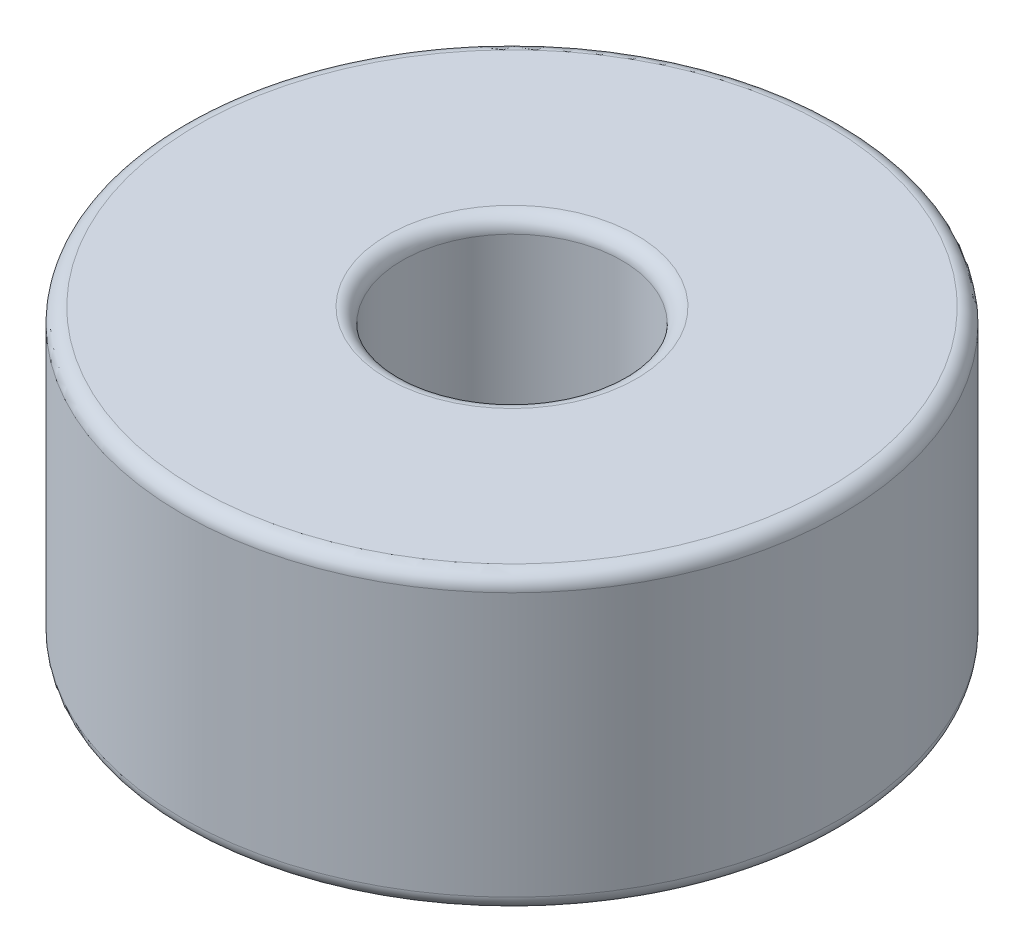
ISO-10303-21;
HEADER;
FILE_DESCRIPTION(('STEP AP214'),'2;1');
FILE_NAME('part.step','',(''),(''),'','','');
FILE_SCHEMA(('AUTOMOTIVE_DESIGN { 1 0 10303 214 1 1 1 1 }'));
ENDSEC;
DATA;
#1=APPLICATION_CONTEXT('core data for automotive mechanical design processes');
#2=APPLICATION_PROTOCOL_DEFINITION('international standard','automotive_design',2000,#1);
#3=PRODUCT_CONTEXT('',#1,'mechanical');
#4=PRODUCT('Part','Part','',(#3));
#5=PRODUCT_RELATED_PRODUCT_CATEGORY('part','',(#4));
#6=PRODUCT_DEFINITION_FORMATION('','',#4);
#7=PRODUCT_DEFINITION_CONTEXT('part definition',#1,'design');
#8=PRODUCT_DEFINITION('design','',#6,#7);
#9=PRODUCT_DEFINITION_SHAPE('','',#8);
#10=(LENGTH_UNIT() NAMED_UNIT(*) SI_UNIT(.MILLI.,.METRE.));
#11=(NAMED_UNIT(*) PLANE_ANGLE_UNIT() SI_UNIT($,.RADIAN.));
#12=(NAMED_UNIT(*) SI_UNIT($,.STERADIAN.) SOLID_ANGLE_UNIT());
#13=UNCERTAINTY_MEASURE_WITH_UNIT(LENGTH_MEASURE(1.E-05),#10,'distance_accuracy_value','');
#14=(GEOMETRIC_REPRESENTATION_CONTEXT(3) GLOBAL_UNCERTAINTY_ASSIGNED_CONTEXT((#13)) GLOBAL_UNIT_ASSIGNED_CONTEXT((#10,
#11,#12)) REPRESENTATION_CONTEXT('',''));
#15=CARTESIAN_POINT('',(0.,0.,0.));
#16=DIRECTION('',(0.,0.,1.));
#17=DIRECTION('',(1.,0.,0.));
#18=AXIS2_PLACEMENT_3D('',#15,#16,#17);
#19=CARTESIAN_POINT('',(0.,40.,0.));
#20=DIRECTION('',(0.,1.,0.));
#21=DIRECTION('',(0.,0.,1.));
#22=AXIS2_PLACEMENT_3D('',#19,#20,#21);
#23=PLANE('',#22);
#24=CARTESIAN_POINT('',(0.,40.,0.));
#25=DIRECTION('',(0.,1.,0.));
#26=DIRECTION('',(0.,0.,1.));
#27=AXIS2_PLACEMENT_3D('',#24,#25,#26);
#28=CIRCLE('',#27,17.);
#29=CARTESIAN_POINT('',(0.,40.,17.));
#30=VERTEX_POINT('',#29);
#31=EDGE_CURVE('E10',#30,#30,#28,.F.);
#32=ORIENTED_EDGE('',*,*,#31,.T.);
#33=EDGE_LOOP('',(#32));
#34=FACE_BOUND('',#33,.T.);
#35=CARTESIAN_POINT('',(0.,40.,0.));
#36=DIRECTION('',(0.,1.,0.));
#37=DIRECTION('',(0.,0.,1.));
#38=AXIS2_PLACEMENT_3D('',#35,#36,#37);
#39=CIRCLE('',#38,43.);
#40=CARTESIAN_POINT('',(0.,40.,43.));
#41=VERTEX_POINT('',#40);
#42=EDGE_CURVE('E38',#41,#41,#39,.T.);
#43=ORIENTED_EDGE('',*,*,#42,.T.);
#44=EDGE_LOOP('',(#43));
#45=FACE_BOUND('',#44,.T.);
#46=ADVANCED_FACE('F31',(#34,#45),#23,.T.);
#47=CARTESIAN_POINT('',(0.,0.,0.));
#48=DIRECTION('',(0.,1.,0.));
#49=DIRECTION('',(0.,0.,1.));
#50=AXIS2_PLACEMENT_3D('',#47,#48,#49);
#51=PLANE('',#50);
#52=CARTESIAN_POINT('',(0.,0.,0.));
#53=DIRECTION('',(0.,1.,0.));
#54=DIRECTION('',(0.,0.,1.));
#55=AXIS2_PLACEMENT_3D('',#52,#53,#54);
#56=CIRCLE('',#55,17.);
#57=CARTESIAN_POINT('',(0.,0.,17.));
#58=VERTEX_POINT('',#57);
#59=EDGE_CURVE('E57',#58,#58,#56,.T.);
#60=ORIENTED_EDGE('',*,*,#59,.T.);
#61=EDGE_LOOP('',(#60));
#62=FACE_BOUND('',#61,.T.);
#63=CARTESIAN_POINT('',(0.,0.,0.));
#64=DIRECTION('',(0.,1.,0.));
#65=DIRECTION('',(0.,0.,1.));
#66=AXIS2_PLACEMENT_3D('',#63,#64,#65);
#67=CIRCLE('',#66,43.);
#68=CARTESIAN_POINT('',(0.,0.,43.));
#69=VERTEX_POINT('',#68);
#70=EDGE_CURVE('E60',#69,#69,#67,.F.);
#71=ORIENTED_EDGE('',*,*,#70,.T.);
#72=EDGE_LOOP('',(#71));
#73=FACE_BOUND('',#72,.T.);
#74=ADVANCED_FACE('F64',(#62,#73),#51,.F.);
#75=CARTESIAN_POINT('',(0.,40.,0.));
#76=DIRECTION('',(0.,-1.,0.));
#77=DIRECTION('',(0.,0.,-1.));
#78=AXIS2_PLACEMENT_3D('',#75,#76,#77);
#79=CYLINDRICAL_SURFACE('',#78,45.);
#80=CARTESIAN_POINT('',(0.,2.,0.));
#81=DIRECTION('',(0.,1.,0.));
#82=DIRECTION('',(0.,0.,1.));
#83=AXIS2_PLACEMENT_3D('',#80,#81,#82);
#84=CIRCLE('',#83,45.);
#85=CARTESIAN_POINT('',(0.,2.,45.));
#86=VERTEX_POINT('',#85);
#87=EDGE_CURVE('E42',#86,#86,#84,.T.);
#88=ORIENTED_EDGE('',*,*,#87,.T.);
#89=EDGE_LOOP('',(#88));
#90=FACE_BOUND('',#89,.T.);
#91=CARTESIAN_POINT('',(0.,38.,0.));
#92=DIRECTION('',(0.,1.,0.));
#93=DIRECTION('',(0.,0.,1.));
#94=AXIS2_PLACEMENT_3D('',#91,#92,#93);
#95=CIRCLE('',#94,45.);
#96=CARTESIAN_POINT('',(0.,38.,45.));
#97=VERTEX_POINT('',#96);
#98=EDGE_CURVE('E46',#97,#97,#95,.F.);
#99=ORIENTED_EDGE('',*,*,#98,.T.);
#100=EDGE_LOOP('',(#99));
#101=FACE_BOUND('',#100,.T.);
#102=ADVANCED_FACE('F74',(#90,#101),#79,.T.);
#103=CARTESIAN_POINT('',(0.,40.,0.));
#104=DIRECTION('',(0.,-1.,0.));
#105=DIRECTION('',(0.,0.,-1.));
#106=AXIS2_PLACEMENT_3D('',#103,#104,#105);
#107=CYLINDRICAL_SURFACE('',#106,15.);
#108=CARTESIAN_POINT('',(0.,2.,0.));
#109=DIRECTION('',(0.,1.,0.));
#110=DIRECTION('',(0.,0.,1.));
#111=AXIS2_PLACEMENT_3D('',#108,#109,#110);
#112=CIRCLE('',#111,15.);
#113=CARTESIAN_POINT('',(0.,2.,15.));
#114=VERTEX_POINT('',#113);
#115=EDGE_CURVE('E51',#114,#114,#112,.F.);
#116=ORIENTED_EDGE('',*,*,#115,.T.);
#117=EDGE_LOOP('',(#116));
#118=FACE_BOUND('',#117,.T.);
#119=CARTESIAN_POINT('',(0.,38.,0.));
#120=DIRECTION('',(0.,1.,0.));
#121=DIRECTION('',(0.,0.,1.));
#122=AXIS2_PLACEMENT_3D('',#119,#120,#121);
#123=CIRCLE('',#122,15.);
#124=CARTESIAN_POINT('',(0.,38.,15.));
#125=VERTEX_POINT('',#124);
#126=EDGE_CURVE('E54',#125,#125,#123,.T.);
#127=ORIENTED_EDGE('',*,*,#126,.T.);
#128=EDGE_LOOP('',(#127));
#129=FACE_BOUND('',#128,.T.);
#130=ADVANCED_FACE('F77',(#118,#129),#107,.F.);
#131=CARTESIAN_POINT('',(0.,2.,0.));
#132=DIRECTION('',(0.,1.,0.));
#133=DIRECTION('',(0.,0.,1.));
#134=AXIS2_PLACEMENT_3D('',#131,#132,#133);
#135=TOROIDAL_SURFACE('',#134,17.,2.);
#136=ORIENTED_EDGE('',*,*,#115,.F.);
#137=EDGE_LOOP('',(#136));
#138=FACE_BOUND('',#137,.T.);
#139=ORIENTED_EDGE('',*,*,#59,.F.);
#140=EDGE_LOOP('',(#139));
#141=FACE_BOUND('',#140,.T.);
#142=ADVANCED_FACE('F70',(#138,#141),#135,.T.);
#143=CARTESIAN_POINT('',(0.,2.,0.));
#144=DIRECTION('',(0.,1.,0.));
#145=DIRECTION('',(0.,0.,1.));
#146=AXIS2_PLACEMENT_3D('',#143,#144,#145);
#147=TOROIDAL_SURFACE('',#146,43.,2.);
#148=ORIENTED_EDGE('',*,*,#70,.F.);
#149=EDGE_LOOP('',(#148));
#150=FACE_BOUND('',#149,.T.);
#151=ORIENTED_EDGE('',*,*,#87,.F.);
#152=EDGE_LOOP('',(#151));
#153=FACE_BOUND('',#152,.T.);
#154=ADVANCED_FACE('F66',(#150,#153),#147,.T.);
#155=CARTESIAN_POINT('',(0.,38.,0.));
#156=DIRECTION('',(0.,1.,0.));
#157=DIRECTION('',(0.,0.,1.));
#158=AXIS2_PLACEMENT_3D('',#155,#156,#157);
#159=TOROIDAL_SURFACE('',#158,17.,2.);
#160=ORIENTED_EDGE('',*,*,#31,.F.);
#161=EDGE_LOOP('',(#160));
#162=FACE_BOUND('',#161,.T.);
#163=ORIENTED_EDGE('',*,*,#126,.F.);
#164=EDGE_LOOP('',(#163));
#165=FACE_BOUND('',#164,.T.);
#166=ADVANCED_FACE('F69',(#162,#165),#159,.T.);
#167=CARTESIAN_POINT('',(0.,38.,0.));
#168=DIRECTION('',(0.,1.,0.));
#169=DIRECTION('',(0.,0.,1.));
#170=AXIS2_PLACEMENT_3D('',#167,#168,#169);
#171=TOROIDAL_SURFACE('',#170,43.,2.);
#172=ORIENTED_EDGE('',*,*,#98,.F.);
#173=EDGE_LOOP('',(#172));
#174=FACE_BOUND('',#173,.T.);
#175=ORIENTED_EDGE('',*,*,#42,.F.);
#176=EDGE_LOOP('',(#175));
#177=FACE_BOUND('',#176,.T.);
#178=ADVANCED_FACE('F33',(#174,#177),#171,.T.);
#179=CLOSED_SHELL('',(#46,#74,#102,#130,#142,#154,#166,#178));
#180=MANIFOLD_SOLID_BREP('B2',#179);
#181=ADVANCED_BREP_SHAPE_REPRESENTATION('',(#18,#180),#14);
#182=SHAPE_DEFINITION_REPRESENTATION(#9,#181);
ENDSEC;
END-ISO-10303-21;
